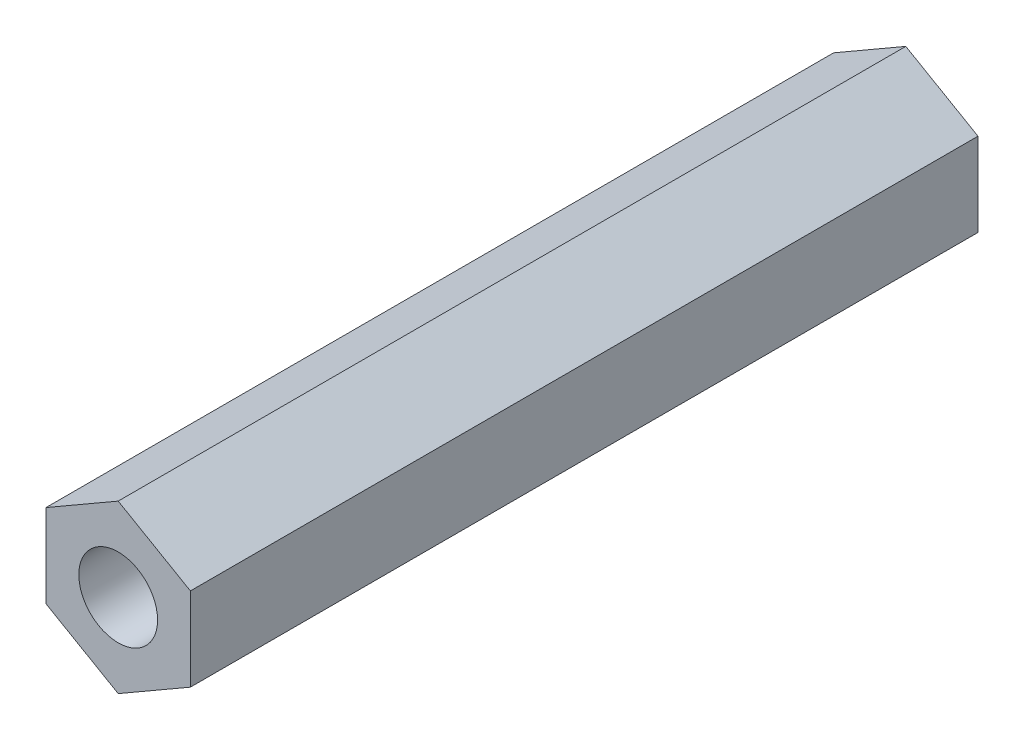
ISO-10303-21;
HEADER;
FILE_DESCRIPTION(('STEP AP214'),'2;1');
FILE_NAME('part.step','',(''),(''),'','','');
FILE_SCHEMA(('AUTOMOTIVE_DESIGN { 1 0 10303 214 1 1 1 1 }'));
ENDSEC;
DATA;
#1=APPLICATION_CONTEXT('core data for automotive mechanical design processes');
#2=APPLICATION_PROTOCOL_DEFINITION('international standard','automotive_design',2000,#1);
#3=PRODUCT_CONTEXT('',#1,'mechanical');
#4=PRODUCT('Part','Part','',(#3));
#5=PRODUCT_RELATED_PRODUCT_CATEGORY('part','',(#4));
#6=PRODUCT_DEFINITION_FORMATION('','',#4);
#7=PRODUCT_DEFINITION_CONTEXT('part definition',#1,'design');
#8=PRODUCT_DEFINITION('design','',#6,#7);
#9=PRODUCT_DEFINITION_SHAPE('','',#8);
#10=(LENGTH_UNIT() NAMED_UNIT(*) SI_UNIT(.MILLI.,.METRE.));
#11=(NAMED_UNIT(*) PLANE_ANGLE_UNIT() SI_UNIT($,.RADIAN.));
#12=(NAMED_UNIT(*) SI_UNIT($,.STERADIAN.) SOLID_ANGLE_UNIT());
#13=UNCERTAINTY_MEASURE_WITH_UNIT(LENGTH_MEASURE(1.E-05),#10,'distance_accuracy_value','');
#14=(GEOMETRIC_REPRESENTATION_CONTEXT(3) GLOBAL_UNCERTAINTY_ASSIGNED_CONTEXT((#13)) GLOBAL_UNIT_ASSIGNED_CONTEXT((#10,
#11,#12)) REPRESENTATION_CONTEXT('',''));
#15=CARTESIAN_POINT('',(0.,0.,0.));
#16=DIRECTION('',(0.,0.,1.));
#17=DIRECTION('',(1.,0.,0.));
#18=AXIS2_PLACEMENT_3D('',#15,#16,#17);
#19=CARTESIAN_POINT('',(0.,0.,30.));
#20=DIRECTION('',(0.,0.,1.));
#21=DIRECTION('',(1.,0.,0.));
#22=AXIS2_PLACEMENT_3D('',#19,#20,#21);
#23=PLANE('',#22);
#24=DIRECTION('',(0.866025403784439,-0.5,0.));
#25=VECTOR('',#24,1.);
#26=CARTESIAN_POINT('',(-2.75,-1.58771324027147,30.));
#27=LINE('',#26,#25);
#28=CARTESIAN_POINT('',(-2.75,-1.58771324027147,30.));
#29=VERTEX_POINT('',#28);
#30=CARTESIAN_POINT('',(0.,-3.17542648054294,30.));
#31=VERTEX_POINT('',#30);
#32=EDGE_CURVE('E129',#29,#31,#27,.T.);
#33=ORIENTED_EDGE('',*,*,#32,.T.);
#34=DIRECTION('',(0.866025403784438,0.5,0.));
#35=VECTOR('',#34,1.);
#36=CARTESIAN_POINT('',(0.,-3.17542648054294,30.));
#37=LINE('',#36,#35);
#38=CARTESIAN_POINT('',(2.75,-1.58771324027147,30.));
#39=VERTEX_POINT('',#38);
#40=EDGE_CURVE('E87',#31,#39,#37,.T.);
#41=ORIENTED_EDGE('',*,*,#40,.T.);
#42=DIRECTION('',(0.,1.,0.));
#43=VECTOR('',#42,1.);
#44=CARTESIAN_POINT('',(2.75,-1.58771324027147,30.));
#45=LINE('',#44,#43);
#46=CARTESIAN_POINT('',(2.75,1.58771324027147,30.));
#47=VERTEX_POINT('',#46);
#48=EDGE_CURVE('E100',#39,#47,#45,.T.);
#49=ORIENTED_EDGE('',*,*,#48,.T.);
#50=DIRECTION('',(-0.866025403784438,0.5,0.));
#51=VECTOR('',#50,1.);
#52=CARTESIAN_POINT('',(2.75,1.58771324027147,30.));
#53=LINE('',#52,#51);
#54=CARTESIAN_POINT('',(0.,3.17542648054294,30.));
#55=VERTEX_POINT('',#54);
#56=EDGE_CURVE('E94',#47,#55,#53,.T.);
#57=ORIENTED_EDGE('',*,*,#56,.T.);
#58=DIRECTION('',(-0.866025403784438,-0.5,0.));
#59=VECTOR('',#58,1.);
#60=CARTESIAN_POINT('',(0.,3.17542648054294,30.));
#61=LINE('',#60,#59);
#62=CARTESIAN_POINT('',(-2.75,1.58771324027147,30.));
#63=VERTEX_POINT('',#62);
#64=EDGE_CURVE('E98',#55,#63,#61,.T.);
#65=ORIENTED_EDGE('',*,*,#64,.T.);
#66=DIRECTION('',(0.,-1.,0.));
#67=VECTOR('',#66,1.);
#68=CARTESIAN_POINT('',(-2.75,1.58771324027147,30.));
#69=LINE('',#68,#67);
#70=EDGE_CURVE('E50',#63,#29,#69,.T.);
#71=ORIENTED_EDGE('',*,*,#70,.T.);
#72=EDGE_LOOP('',(#33,#41,#49,#57,#65,#71));
#73=FACE_BOUND('',#72,.T.);
#74=CARTESIAN_POINT('',(0.,0.,30.));
#75=DIRECTION('',(0.,0.,1.));
#76=DIRECTION('',(1.,0.,0.));
#77=AXIS2_PLACEMENT_3D('',#74,#75,#76);
#78=CIRCLE('',#77,1.5);
#79=CARTESIAN_POINT('',(1.5,0.,30.));
#80=VERTEX_POINT('',#79);
#81=EDGE_CURVE('E122',#80,#80,#78,.T.);
#82=ORIENTED_EDGE('',*,*,#81,.F.);
#83=EDGE_LOOP('',(#82));
#84=FACE_BOUND('',#83,.T.);
#85=ADVANCED_FACE('F33',(#73,#84),#23,.T.);
#86=CARTESIAN_POINT('',(0.,0.,0.));
#87=DIRECTION('',(0.,0.,1.));
#88=DIRECTION('',(1.,0.,0.));
#89=AXIS2_PLACEMENT_3D('',#86,#87,#88);
#90=PLANE('',#89);
#91=DIRECTION('',(0.866025403784439,-0.5,0.));
#92=VECTOR('',#91,1.);
#93=CARTESIAN_POINT('',(-2.75,-1.58771324027147,0.));
#94=LINE('',#93,#92);
#95=CARTESIAN_POINT('',(-2.75,-1.58771324027147,0.));
#96=VERTEX_POINT('',#95);
#97=CARTESIAN_POINT('',(0.,-3.17542648054294,0.));
#98=VERTEX_POINT('',#97);
#99=EDGE_CURVE('E118',#96,#98,#94,.T.);
#100=ORIENTED_EDGE('',*,*,#99,.F.);
#101=DIRECTION('',(0.,-1.,0.));
#102=VECTOR('',#101,1.);
#103=CARTESIAN_POINT('',(-2.75,1.58771324027147,0.));
#104=LINE('',#103,#102);
#105=CARTESIAN_POINT('',(-2.75,1.58771324027147,0.));
#106=VERTEX_POINT('',#105);
#107=EDGE_CURVE('E79',#106,#96,#104,.T.);
#108=ORIENTED_EDGE('',*,*,#107,.F.);
#109=DIRECTION('',(-0.866025403784438,-0.5,0.));
#110=VECTOR('',#109,1.);
#111=CARTESIAN_POINT('',(0.,3.17542648054294,0.));
#112=LINE('',#111,#110);
#113=CARTESIAN_POINT('',(0.,3.17542648054294,0.));
#114=VERTEX_POINT('',#113);
#115=EDGE_CURVE('E73',#114,#106,#112,.T.);
#116=ORIENTED_EDGE('',*,*,#115,.F.);
#117=DIRECTION('',(-0.866025403784438,0.5,0.));
#118=VECTOR('',#117,1.);
#119=CARTESIAN_POINT('',(2.75,1.58771324027147,0.));
#120=LINE('',#119,#118);
#121=CARTESIAN_POINT('',(2.75,1.58771324027147,0.));
#122=VERTEX_POINT('',#121);
#123=EDGE_CURVE('E108',#122,#114,#120,.T.);
#124=ORIENTED_EDGE('',*,*,#123,.F.);
#125=DIRECTION('',(0.,1.,0.));
#126=VECTOR('',#125,1.);
#127=CARTESIAN_POINT('',(2.75,-1.58771324027147,0.));
#128=LINE('',#127,#126);
#129=CARTESIAN_POINT('',(2.75,-1.58771324027147,0.));
#130=VERTEX_POINT('',#129);
#131=EDGE_CURVE('E124',#130,#122,#128,.T.);
#132=ORIENTED_EDGE('',*,*,#131,.F.);
#133=DIRECTION('',(0.866025403784438,0.5,0.));
#134=VECTOR('',#133,1.);
#135=CARTESIAN_POINT('',(0.,-3.17542648054294,0.));
#136=LINE('',#135,#134);
#137=EDGE_CURVE('E121',#98,#130,#136,.T.);
#138=ORIENTED_EDGE('',*,*,#137,.F.);
#139=EDGE_LOOP('',(#100,#108,#116,#124,#132,#138));
#140=FACE_BOUND('',#139,.T.);
#141=CARTESIAN_POINT('',(0.,0.,0.));
#142=DIRECTION('',(0.,0.,1.));
#143=DIRECTION('',(1.,0.,0.));
#144=AXIS2_PLACEMENT_3D('',#141,#142,#143);
#145=CIRCLE('',#144,1.5);
#146=CARTESIAN_POINT('',(1.5,0.,0.));
#147=VERTEX_POINT('',#146);
#148=EDGE_CURVE('E222',#147,#147,#145,.T.);
#149=ORIENTED_EDGE('',*,*,#148,.T.);
#150=EDGE_LOOP('',(#149));
#151=FACE_BOUND('',#150,.T.);
#152=ADVANCED_FACE('F138',(#140,#151),#90,.F.);
#153=CARTESIAN_POINT('',(-2.75,-1.58771324027147,30.));
#154=DIRECTION('',(0.5,0.866025403784439,0.));
#155=DIRECTION('',(-0.866025403784439,0.5,0.));
#156=AXIS2_PLACEMENT_3D('',#153,#154,#155);
#157=PLANE('',#156);
#158=ORIENTED_EDGE('',*,*,#99,.T.);
#159=DIRECTION('',(0.,0.,-1.));
#160=VECTOR('',#159,1.);
#161=CARTESIAN_POINT('',(0.,-3.17542648054294,30.));
#162=LINE('',#161,#160);
#163=EDGE_CURVE('E11',#31,#98,#162,.T.);
#164=ORIENTED_EDGE('',*,*,#163,.F.);
#165=ORIENTED_EDGE('',*,*,#32,.F.);
#166=DIRECTION('',(0.,0.,-1.));
#167=VECTOR('',#166,1.);
#168=CARTESIAN_POINT('',(-2.75,-1.58771324027147,30.));
#169=LINE('',#168,#167);
#170=EDGE_CURVE('E114',#29,#96,#169,.T.);
#171=ORIENTED_EDGE('',*,*,#170,.T.);
#172=EDGE_LOOP('',(#158,#164,#165,#171));
#173=FACE_BOUND('',#172,.T.);
#174=ADVANCED_FACE('F35',(#173),#157,.F.);
#175=CARTESIAN_POINT('',(0.,-3.17542648054294,30.));
#176=DIRECTION('',(-0.5,0.866025403784438,0.));
#177=DIRECTION('',(-0.866025403784439,-0.5,0.));
#178=AXIS2_PLACEMENT_3D('',#175,#176,#177);
#179=PLANE('',#178);
#180=ORIENTED_EDGE('',*,*,#137,.T.);
#181=DIRECTION('',(0.,0.,-1.));
#182=VECTOR('',#181,1.);
#183=CARTESIAN_POINT('',(2.75,-1.58771324027147,30.));
#184=LINE('',#183,#182);
#185=EDGE_CURVE('E42',#39,#130,#184,.T.);
#186=ORIENTED_EDGE('',*,*,#185,.F.);
#187=ORIENTED_EDGE('',*,*,#40,.F.);
#188=ORIENTED_EDGE('',*,*,#163,.T.);
#189=EDGE_LOOP('',(#180,#186,#187,#188));
#190=FACE_BOUND('',#189,.T.);
#191=ADVANCED_FACE('F163',(#190),#179,.F.);
#192=CARTESIAN_POINT('',(2.75,-1.58771324027147,30.));
#193=DIRECTION('',(-1.,0.,0.));
#194=DIRECTION('',(0.,0.,1.));
#195=AXIS2_PLACEMENT_3D('',#192,#193,#194);
#196=PLANE('',#195);
#197=ORIENTED_EDGE('',*,*,#131,.T.);
#198=DIRECTION('',(0.,0.,-1.));
#199=VECTOR('',#198,1.);
#200=CARTESIAN_POINT('',(2.75,1.58771324027147,30.));
#201=LINE('',#200,#199);
#202=EDGE_CURVE('E109',#47,#122,#201,.T.);
#203=ORIENTED_EDGE('',*,*,#202,.F.);
#204=ORIENTED_EDGE('',*,*,#48,.F.);
#205=ORIENTED_EDGE('',*,*,#185,.T.);
#206=EDGE_LOOP('',(#197,#203,#204,#205));
#207=FACE_BOUND('',#206,.T.);
#208=ADVANCED_FACE('F135',(#207),#196,.F.);
#209=CARTESIAN_POINT('',(2.75,1.58771324027147,30.));
#210=DIRECTION('',(-0.5,-0.866025403784439,0.));
#211=DIRECTION('',(0.866025403784439,-0.5,0.));
#212=AXIS2_PLACEMENT_3D('',#209,#210,#211);
#213=PLANE('',#212);
#214=ORIENTED_EDGE('',*,*,#123,.T.);
#215=DIRECTION('',(0.,0.,-1.));
#216=VECTOR('',#215,1.);
#217=CARTESIAN_POINT('',(0.,3.17542648054294,30.));
#218=LINE('',#217,#216);
#219=EDGE_CURVE('E105',#55,#114,#218,.T.);
#220=ORIENTED_EDGE('',*,*,#219,.F.);
#221=ORIENTED_EDGE('',*,*,#56,.F.);
#222=ORIENTED_EDGE('',*,*,#202,.T.);
#223=EDGE_LOOP('',(#214,#220,#221,#222));
#224=FACE_BOUND('',#223,.T.);
#225=ADVANCED_FACE('F106',(#224),#213,.F.);
#226=CARTESIAN_POINT('',(0.,3.17542648054294,30.));
#227=DIRECTION('',(0.5,-0.866025403784438,0.));
#228=DIRECTION('',(0.866025403784439,0.5,0.));
#229=AXIS2_PLACEMENT_3D('',#226,#227,#228);
#230=PLANE('',#229);
#231=ORIENTED_EDGE('',*,*,#115,.T.);
#232=DIRECTION('',(0.,0.,-1.));
#233=VECTOR('',#232,1.);
#234=CARTESIAN_POINT('',(-2.75,1.58771324027147,30.));
#235=LINE('',#234,#233);
#236=EDGE_CURVE('E110',#63,#106,#235,.T.);
#237=ORIENTED_EDGE('',*,*,#236,.F.);
#238=ORIENTED_EDGE('',*,*,#64,.F.);
#239=ORIENTED_EDGE('',*,*,#219,.T.);
#240=EDGE_LOOP('',(#231,#237,#238,#239));
#241=FACE_BOUND('',#240,.T.);
#242=ADVANCED_FACE('F112',(#241),#230,.F.);
#243=CARTESIAN_POINT('',(-2.75,1.58771324027147,30.));
#244=DIRECTION('',(1.,0.,0.));
#245=DIRECTION('',(0.,0.,-1.));
#246=AXIS2_PLACEMENT_3D('',#243,#244,#245);
#247=PLANE('',#246);
#248=ORIENTED_EDGE('',*,*,#107,.T.);
#249=ORIENTED_EDGE('',*,*,#170,.F.);
#250=ORIENTED_EDGE('',*,*,#70,.F.);
#251=ORIENTED_EDGE('',*,*,#236,.T.);
#252=EDGE_LOOP('',(#248,#249,#250,#251));
#253=FACE_BOUND('',#252,.T.);
#254=ADVANCED_FACE('F143',(#253),#247,.F.);
#255=CARTESIAN_POINT('',(0.,0.,30.));
#256=DIRECTION('',(0.,0.,-1.));
#257=DIRECTION('',(-1.,0.,0.));
#258=AXIS2_PLACEMENT_3D('',#255,#256,#257);
#259=CYLINDRICAL_SURFACE('',#258,1.5);
#260=ORIENTED_EDGE('',*,*,#81,.T.);
#261=EDGE_LOOP('',(#260));
#262=FACE_BOUND('',#261,.T.);
#263=ORIENTED_EDGE('',*,*,#148,.F.);
#264=EDGE_LOOP('',(#263));
#265=FACE_BOUND('',#264,.T.);
#266=ADVANCED_FACE('F145',(#262,#265),#259,.F.);
#267=CLOSED_SHELL('',(#85,#152,#174,#191,#208,#225,#242,#254,#266));
#268=MANIFOLD_SOLID_BREP('B2',#267);
#269=ADVANCED_BREP_SHAPE_REPRESENTATION('',(#18,#268),#14);
#270=SHAPE_DEFINITION_REPRESENTATION(#9,#269);
ENDSEC;
END-ISO-10303-21;
